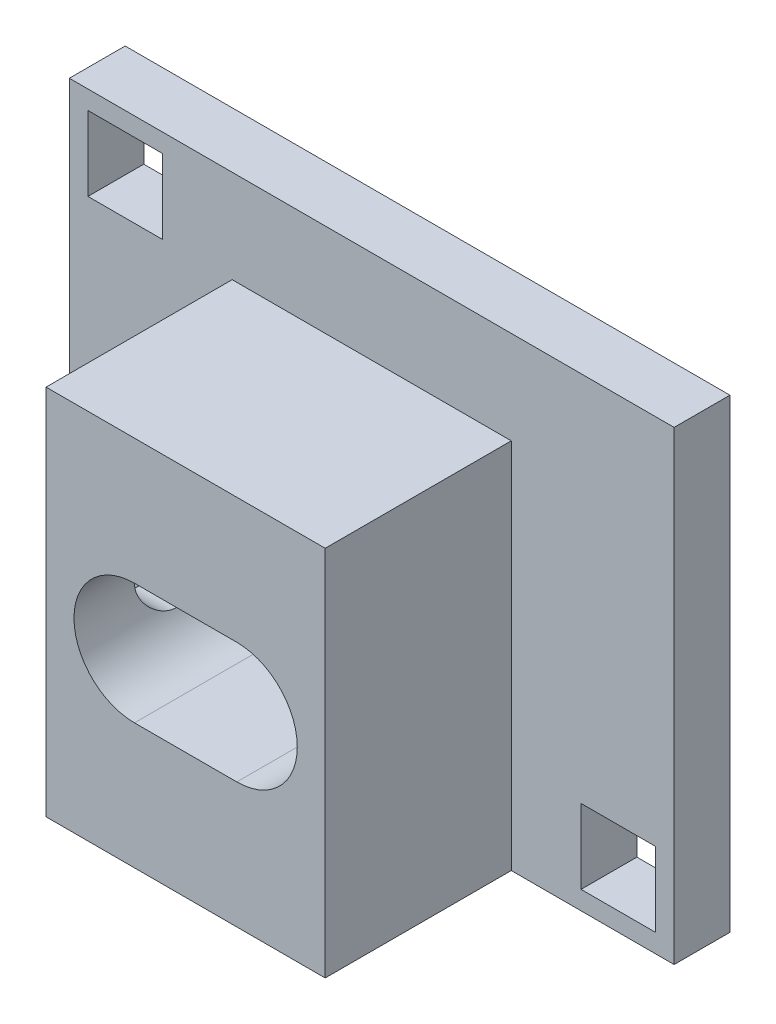
ISO-10303-21;
HEADER;
FILE_DESCRIPTION(('STEP AP214'),'2;1');
FILE_NAME('part.step','',(''),(''),'','','');
FILE_SCHEMA(('AUTOMOTIVE_DESIGN { 1 0 10303 214 1 1 1 1 }'));
ENDSEC;
DATA;
#1=APPLICATION_CONTEXT('core data for automotive mechanical design processes');
#2=APPLICATION_PROTOCOL_DEFINITION('international standard','automotive_design',2000,#1);
#3=PRODUCT_CONTEXT('',#1,'mechanical');
#4=PRODUCT('Part','Part','',(#3));
#5=PRODUCT_RELATED_PRODUCT_CATEGORY('part','',(#4));
#6=PRODUCT_DEFINITION_FORMATION('','',#4);
#7=PRODUCT_DEFINITION_CONTEXT('part definition',#1,'design');
#8=PRODUCT_DEFINITION('design','',#6,#7);
#9=PRODUCT_DEFINITION_SHAPE('','',#8);
#10=(LENGTH_UNIT() NAMED_UNIT(*) SI_UNIT(.MILLI.,.METRE.));
#11=(NAMED_UNIT(*) PLANE_ANGLE_UNIT() SI_UNIT($,.RADIAN.));
#12=(NAMED_UNIT(*) SI_UNIT($,.STERADIAN.) SOLID_ANGLE_UNIT());
#13=UNCERTAINTY_MEASURE_WITH_UNIT(LENGTH_MEASURE(1.E-05),#10,'distance_accuracy_value','');
#14=(GEOMETRIC_REPRESENTATION_CONTEXT(3) GLOBAL_UNCERTAINTY_ASSIGNED_CONTEXT((#13)) GLOBAL_UNIT_ASSIGNED_CONTEXT((#10,
#11,#12)) REPRESENTATION_CONTEXT('',''));
#15=CARTESIAN_POINT('',(0.,0.,0.));
#16=DIRECTION('',(0.,0.,1.));
#17=DIRECTION('',(1.,0.,0.));
#18=AXIS2_PLACEMENT_3D('',#15,#16,#17);
#19=CARTESIAN_POINT('',(0.,0.,6.));
#20=DIRECTION('',(0.,0.,-1.));
#21=DIRECTION('',(-1.,0.,0.));
#22=AXIS2_PLACEMENT_3D('',#19,#20,#21);
#23=PLANE('',#22);
#24=DIRECTION('',(-1.,0.,0.));
#25=VECTOR('',#24,1.);
#26=CARTESIAN_POINT('',(-30.5,23.,6.));
#27=LINE('',#26,#25);
#28=CARTESIAN_POINT('',(-22.5,23.,6.));
#29=VERTEX_POINT('',#28);
#30=CARTESIAN_POINT('',(-30.5,23.,6.));
#31=VERTEX_POINT('',#30);
#32=EDGE_CURVE('E325',#29,#31,#27,.T.);
#33=ORIENTED_EDGE('',*,*,#32,.F.);
#34=DIRECTION('',(0.,1.,0.));
#35=VECTOR('',#34,1.);
#36=CARTESIAN_POINT('',(-22.5,15.,6.));
#37=LINE('',#36,#35);
#38=CARTESIAN_POINT('',(-22.5,15.,6.));
#39=VERTEX_POINT('',#38);
#40=EDGE_CURVE('E328',#39,#29,#37,.T.);
#41=ORIENTED_EDGE('',*,*,#40,.F.);
#42=DIRECTION('',(1.,0.,0.));
#43=VECTOR('',#42,1.);
#44=CARTESIAN_POINT('',(-30.5,15.,6.));
#45=LINE('',#44,#43);
#46=CARTESIAN_POINT('',(-30.5,15.,6.));
#47=VERTEX_POINT('',#46);
#48=EDGE_CURVE('E318',#47,#39,#45,.T.);
#49=ORIENTED_EDGE('',*,*,#48,.F.);
#50=DIRECTION('',(0.,-1.,0.));
#51=VECTOR('',#50,1.);
#52=CARTESIAN_POINT('',(-30.5,15.,6.));
#53=LINE('',#52,#51);
#54=EDGE_CURVE('E322',#31,#47,#53,.T.);
#55=ORIENTED_EDGE('',*,*,#54,.F.);
#56=EDGE_LOOP('',(#33,#41,#49,#55));
#57=FACE_BOUND('',#56,.T.);
#58=DIRECTION('',(-1.,0.,0.));
#59=VECTOR('',#58,1.);
#60=CARTESIAN_POINT('',(30.5,-15.,6.));
#61=LINE('',#60,#59);
#62=CARTESIAN_POINT('',(30.5,-15.,6.));
#63=VERTEX_POINT('',#62);
#64=CARTESIAN_POINT('',(22.5,-15.,6.));
#65=VERTEX_POINT('',#64);
#66=EDGE_CURVE('E357',#63,#65,#61,.T.);
#67=ORIENTED_EDGE('',*,*,#66,.F.);
#68=DIRECTION('',(0.,1.,0.));
#69=VECTOR('',#68,1.);
#70=CARTESIAN_POINT('',(30.5,-23.,6.));
#71=LINE('',#70,#69);
#72=CARTESIAN_POINT('',(30.5,-23.,6.));
#73=VERTEX_POINT('',#72);
#74=EDGE_CURVE('E360',#73,#63,#71,.T.);
#75=ORIENTED_EDGE('',*,*,#74,.F.);
#76=DIRECTION('',(1.,0.,0.));
#77=VECTOR('',#76,1.);
#78=CARTESIAN_POINT('',(30.5,-23.,6.));
#79=LINE('',#78,#77);
#80=CARTESIAN_POINT('',(22.5,-23.,6.));
#81=VERTEX_POINT('',#80);
#82=EDGE_CURVE('E350',#81,#73,#79,.T.);
#83=ORIENTED_EDGE('',*,*,#82,.F.);
#84=DIRECTION('',(0.,-1.,0.));
#85=VECTOR('',#84,1.);
#86=CARTESIAN_POINT('',(22.5,-23.,6.));
#87=LINE('',#86,#85);
#88=EDGE_CURVE('E354',#65,#81,#87,.T.);
#89=ORIENTED_EDGE('',*,*,#88,.F.);
#90=EDGE_LOOP('',(#67,#75,#83,#89));
#91=FACE_BOUND('',#90,.T.);
#92=DIRECTION('',(0.,1.,0.));
#93=VECTOR('',#92,1.);
#94=CARTESIAN_POINT('',(15.,15.,6.));
#95=LINE('',#94,#93);
#96=CARTESIAN_POINT('',(15.,-25.,6.));
#97=VERTEX_POINT('',#96);
#98=CARTESIAN_POINT('',(15.,15.,6.));
#99=VERTEX_POINT('',#98);
#100=EDGE_CURVE('E221',#97,#99,#95,.T.);
#101=ORIENTED_EDGE('',*,*,#100,.F.);
#102=DIRECTION('',(1.,0.,0.));
#103=VECTOR('',#102,1.);
#104=CARTESIAN_POINT('',(-32.5,-25.,6.));
#105=LINE('',#104,#103);
#106=CARTESIAN_POINT('',(32.5,-25.,6.));
#107=VERTEX_POINT('',#106);
#108=EDGE_CURVE('E260',#97,#107,#105,.T.);
#109=ORIENTED_EDGE('',*,*,#108,.T.);
#110=DIRECTION('',(0.,1.,0.));
#111=VECTOR('',#110,1.);
#112=CARTESIAN_POINT('',(32.5,-25.,6.));
#113=LINE('',#112,#111);
#114=CARTESIAN_POINT('',(32.5,25.,6.));
#115=VERTEX_POINT('',#114);
#116=EDGE_CURVE('E280',#107,#115,#113,.T.);
#117=ORIENTED_EDGE('',*,*,#116,.T.);
#118=DIRECTION('',(-1.,0.,0.));
#119=VECTOR('',#118,1.);
#120=CARTESIAN_POINT('',(-32.5,25.,6.));
#121=LINE('',#120,#119);
#122=CARTESIAN_POINT('',(-32.5,25.,6.));
#123=VERTEX_POINT('',#122);
#124=EDGE_CURVE('E306',#115,#123,#121,.T.);
#125=ORIENTED_EDGE('',*,*,#124,.T.);
#126=DIRECTION('',(0.,-1.,0.));
#127=VECTOR('',#126,1.);
#128=CARTESIAN_POINT('',(-32.5,-25.,6.));
#129=LINE('',#128,#127);
#130=CARTESIAN_POINT('',(-32.5,-25.,6.));
#131=VERTEX_POINT('',#130);
#132=EDGE_CURVE('E264',#123,#131,#129,.T.);
#133=ORIENTED_EDGE('',*,*,#132,.T.);
#134=CARTESIAN_POINT('',(-15.,-25.,6.));
#135=VERTEX_POINT('',#134);
#136=EDGE_CURVE('E263',#131,#135,#105,.T.);
#137=ORIENTED_EDGE('',*,*,#136,.T.);
#138=DIRECTION('',(0.,-1.,0.));
#139=VECTOR('',#138,1.);
#140=CARTESIAN_POINT('',(-15.,15.,6.));
#141=LINE('',#140,#139);
#142=CARTESIAN_POINT('',(-15.,15.,6.));
#143=VERTEX_POINT('',#142);
#144=EDGE_CURVE('E226',#143,#135,#141,.T.);
#145=ORIENTED_EDGE('',*,*,#144,.F.);
#146=DIRECTION('',(-1.,0.,0.));
#147=VECTOR('',#146,1.);
#148=CARTESIAN_POINT('',(-15.,15.,6.));
#149=LINE('',#148,#147);
#150=EDGE_CURVE('E69',#99,#143,#149,.T.);
#151=ORIENTED_EDGE('',*,*,#150,.F.);
#152=EDGE_LOOP('',(#101,#109,#117,#125,#133,#137,#145,#151));
#153=FACE_BOUND('',#152,.T.);
#154=ADVANCED_FACE('F44',(#57,#91,#153),#23,.F.);
#155=CARTESIAN_POINT('',(32.5,-25.,6.));
#156=DIRECTION('',(-1.,0.,0.));
#157=DIRECTION('',(0.,0.,1.));
#158=AXIS2_PLACEMENT_3D('',#155,#156,#157);
#159=PLANE('',#158);
#160=DIRECTION('',(0.,1.,0.));
#161=VECTOR('',#160,1.);
#162=CARTESIAN_POINT('',(32.5,-25.,0.));
#163=LINE('',#162,#161);
#164=CARTESIAN_POINT('',(32.5,-25.,0.));
#165=VERTEX_POINT('',#164);
#166=CARTESIAN_POINT('',(32.5,25.,0.));
#167=VERTEX_POINT('',#166);
#168=EDGE_CURVE('E269',#165,#167,#163,.T.);
#169=ORIENTED_EDGE('',*,*,#168,.T.);
#170=DIRECTION('',(0.,0.,-1.));
#171=VECTOR('',#170,1.);
#172=CARTESIAN_POINT('',(32.5,25.,6.));
#173=LINE('',#172,#171);
#174=EDGE_CURVE('E13',#115,#167,#173,.T.);
#175=ORIENTED_EDGE('',*,*,#174,.F.);
#176=ORIENTED_EDGE('',*,*,#116,.F.);
#177=DIRECTION('',(0.,0.,-1.));
#178=VECTOR('',#177,1.);
#179=CARTESIAN_POINT('',(32.5,-25.,6.));
#180=LINE('',#179,#178);
#181=EDGE_CURVE('E281',#107,#165,#180,.T.);
#182=ORIENTED_EDGE('',*,*,#181,.T.);
#183=EDGE_LOOP('',(#169,#175,#176,#182));
#184=FACE_BOUND('',#183,.T.);
#185=ADVANCED_FACE('F46',(#184),#159,.F.);
#186=CARTESIAN_POINT('',(-32.5,25.,6.));
#187=DIRECTION('',(0.,-1.,0.));
#188=DIRECTION('',(0.,0.,-1.));
#189=AXIS2_PLACEMENT_3D('',#186,#187,#188);
#190=PLANE('',#189);
#191=DIRECTION('',(-1.,0.,0.));
#192=VECTOR('',#191,1.);
#193=CARTESIAN_POINT('',(-32.5,25.,0.));
#194=LINE('',#193,#192);
#195=CARTESIAN_POINT('',(-32.5,25.,0.));
#196=VERTEX_POINT('',#195);
#197=EDGE_CURVE('E273',#167,#196,#194,.T.);
#198=ORIENTED_EDGE('',*,*,#197,.T.);
#199=DIRECTION('',(0.,0.,-1.));
#200=VECTOR('',#199,1.);
#201=CARTESIAN_POINT('',(-32.5,25.,6.));
#202=LINE('',#201,#200);
#203=EDGE_CURVE('E53',#123,#196,#202,.T.);
#204=ORIENTED_EDGE('',*,*,#203,.F.);
#205=ORIENTED_EDGE('',*,*,#124,.F.);
#206=ORIENTED_EDGE('',*,*,#174,.T.);
#207=EDGE_LOOP('',(#198,#204,#205,#206));
#208=FACE_BOUND('',#207,.T.);
#209=ADVANCED_FACE('F381',(#208),#190,.F.);
#210=CARTESIAN_POINT('',(-32.5,-25.,6.));
#211=DIRECTION('',(1.,0.,0.));
#212=DIRECTION('',(0.,0.,-1.));
#213=AXIS2_PLACEMENT_3D('',#210,#211,#212);
#214=PLANE('',#213);
#215=DIRECTION('',(0.,-1.,0.));
#216=VECTOR('',#215,1.);
#217=CARTESIAN_POINT('',(-32.5,-25.,0.));
#218=LINE('',#217,#216);
#219=CARTESIAN_POINT('',(-32.5,-25.,0.));
#220=VERTEX_POINT('',#219);
#221=EDGE_CURVE('E276',#196,#220,#218,.T.);
#222=ORIENTED_EDGE('',*,*,#221,.T.);
#223=DIRECTION('',(0.,0.,-1.));
#224=VECTOR('',#223,1.);
#225=CARTESIAN_POINT('',(-32.5,-25.,6.));
#226=LINE('',#225,#224);
#227=EDGE_CURVE('E284',#131,#220,#226,.T.);
#228=ORIENTED_EDGE('',*,*,#227,.F.);
#229=ORIENTED_EDGE('',*,*,#132,.F.);
#230=ORIENTED_EDGE('',*,*,#203,.T.);
#231=EDGE_LOOP('',(#222,#228,#229,#230));
#232=FACE_BOUND('',#231,.T.);
#233=ADVANCED_FACE('F292',(#232),#214,.F.);
#234=CARTESIAN_POINT('',(-32.5,-25.,6.));
#235=DIRECTION('',(0.,1.,0.));
#236=DIRECTION('',(0.,0.,1.));
#237=AXIS2_PLACEMENT_3D('',#234,#235,#236);
#238=PLANE('',#237);
#239=DIRECTION('',(1.,0.,0.));
#240=VECTOR('',#239,1.);
#241=CARTESIAN_POINT('',(-32.5,-25.,0.));
#242=LINE('',#241,#240);
#243=EDGE_CURVE('E278',#220,#165,#242,.T.);
#244=ORIENTED_EDGE('',*,*,#243,.T.);
#245=ORIENTED_EDGE('',*,*,#181,.F.);
#246=ORIENTED_EDGE('',*,*,#108,.F.);
#247=DIRECTION('',(0.,0.,-1.));
#248=VECTOR('',#247,1.);
#249=CARTESIAN_POINT('',(15.,-25.,26.));
#250=LINE('',#249,#248);
#251=CARTESIAN_POINT('',(15.,-25.,26.));
#252=VERTEX_POINT('',#251);
#253=EDGE_CURVE('E232',#252,#97,#250,.T.);
#254=ORIENTED_EDGE('',*,*,#253,.F.);
#255=DIRECTION('',(1.,0.,0.));
#256=VECTOR('',#255,1.);
#257=CARTESIAN_POINT('',(-15.,-25.,26.));
#258=LINE('',#257,#256);
#259=CARTESIAN_POINT('',(-15.,-25.,26.));
#260=VERTEX_POINT('',#259);
#261=EDGE_CURVE('E230',#260,#252,#258,.T.);
#262=ORIENTED_EDGE('',*,*,#261,.F.);
#263=DIRECTION('',(0.,0.,-1.));
#264=VECTOR('',#263,1.);
#265=CARTESIAN_POINT('',(-15.,-25.,26.));
#266=LINE('',#265,#264);
#267=EDGE_CURVE('E243',#260,#135,#266,.T.);
#268=ORIENTED_EDGE('',*,*,#267,.T.);
#269=ORIENTED_EDGE('',*,*,#136,.F.);
#270=ORIENTED_EDGE('',*,*,#227,.T.);
#271=EDGE_LOOP('',(#244,#245,#246,#254,#262,#268,#269,#270));
#272=FACE_BOUND('',#271,.T.);
#273=ADVANCED_FACE('F300',(#272),#238,.F.);
#274=CARTESIAN_POINT('',(0.,0.,0.));
#275=DIRECTION('',(0.,0.,-1.));
#276=DIRECTION('',(-1.,0.,0.));
#277=AXIS2_PLACEMENT_3D('',#274,#275,#276);
#278=PLANE('',#277);
#279=DIRECTION('',(0.,1.,0.));
#280=VECTOR('',#279,1.);
#281=CARTESIAN_POINT('',(30.5,-23.,0.));
#282=LINE('',#281,#280);
#283=CARTESIAN_POINT('',(30.5,-23.,0.));
#284=VERTEX_POINT('',#283);
#285=CARTESIAN_POINT('',(30.5,-15.,0.));
#286=VERTEX_POINT('',#285);
#287=EDGE_CURVE('E353',#284,#286,#282,.T.);
#288=ORIENTED_EDGE('',*,*,#287,.T.);
#289=DIRECTION('',(-1.,0.,0.));
#290=VECTOR('',#289,1.);
#291=CARTESIAN_POINT('',(30.5,-15.,0.));
#292=LINE('',#291,#290);
#293=CARTESIAN_POINT('',(22.5,-15.,0.));
#294=VERTEX_POINT('',#293);
#295=EDGE_CURVE('E367',#286,#294,#292,.T.);
#296=ORIENTED_EDGE('',*,*,#295,.T.);
#297=DIRECTION('',(0.,-1.,0.));
#298=VECTOR('',#297,1.);
#299=CARTESIAN_POINT('',(22.5,-23.,0.));
#300=LINE('',#299,#298);
#301=CARTESIAN_POINT('',(22.5,-23.,0.));
#302=VERTEX_POINT('',#301);
#303=EDGE_CURVE('E364',#294,#302,#300,.T.);
#304=ORIENTED_EDGE('',*,*,#303,.T.);
#305=DIRECTION('',(1.,0.,0.));
#306=VECTOR('',#305,1.);
#307=CARTESIAN_POINT('',(30.5,-23.,0.));
#308=LINE('',#307,#306);
#309=EDGE_CURVE('E345',#302,#284,#308,.T.);
#310=ORIENTED_EDGE('',*,*,#309,.T.);
#311=EDGE_LOOP('',(#288,#296,#304,#310));
#312=FACE_BOUND('',#311,.T.);
#313=DIRECTION('',(0.,1.,0.));
#314=VECTOR('',#313,1.);
#315=CARTESIAN_POINT('',(-22.5,15.,0.));
#316=LINE('',#315,#314);
#317=CARTESIAN_POINT('',(-22.5,15.,0.));
#318=VERTEX_POINT('',#317);
#319=CARTESIAN_POINT('',(-22.5,23.,0.));
#320=VERTEX_POINT('',#319);
#321=EDGE_CURVE('E321',#318,#320,#316,.T.);
#322=ORIENTED_EDGE('',*,*,#321,.T.);
#323=DIRECTION('',(-1.,0.,0.));
#324=VECTOR('',#323,1.);
#325=CARTESIAN_POINT('',(-30.5,23.,0.));
#326=LINE('',#325,#324);
#327=CARTESIAN_POINT('',(-30.5,23.,0.));
#328=VERTEX_POINT('',#327);
#329=EDGE_CURVE('E336',#320,#328,#326,.T.);
#330=ORIENTED_EDGE('',*,*,#329,.T.);
#331=DIRECTION('',(0.,-1.,0.));
#332=VECTOR('',#331,1.);
#333=CARTESIAN_POINT('',(-30.5,15.,0.));
#334=LINE('',#333,#332);
#335=CARTESIAN_POINT('',(-30.5,15.,0.));
#336=VERTEX_POINT('',#335);
#337=EDGE_CURVE('E333',#328,#336,#334,.T.);
#338=ORIENTED_EDGE('',*,*,#337,.T.);
#339=DIRECTION('',(1.,0.,0.));
#340=VECTOR('',#339,1.);
#341=CARTESIAN_POINT('',(-30.5,15.,0.));
#342=LINE('',#341,#340);
#343=EDGE_CURVE('E313',#336,#318,#342,.T.);
#344=ORIENTED_EDGE('',*,*,#343,.T.);
#345=EDGE_LOOP('',(#322,#330,#338,#344));
#346=FACE_BOUND('',#345,.T.);
#347=ORIENTED_EDGE('',*,*,#168,.F.);
#348=ORIENTED_EDGE('',*,*,#243,.F.);
#349=ORIENTED_EDGE('',*,*,#221,.F.);
#350=ORIENTED_EDGE('',*,*,#197,.F.);
#351=EDGE_LOOP('',(#347,#348,#349,#350));
#352=FACE_BOUND('',#351,.T.);
#353=ADVANCED_FACE('F298',(#312,#346,#352),#278,.T.);
#354=CARTESIAN_POINT('',(-22.5,15.,0.));
#355=DIRECTION('',(1.,0.,0.));
#356=DIRECTION('',(0.,0.,-1.));
#357=AXIS2_PLACEMENT_3D('',#354,#355,#356);
#358=PLANE('',#357);
#359=ORIENTED_EDGE('',*,*,#40,.T.);
#360=DIRECTION('',(0.,0.,1.));
#361=VECTOR('',#360,1.);
#362=CARTESIAN_POINT('',(-22.5,23.,0.));
#363=LINE('',#362,#361);
#364=EDGE_CURVE('E309',#320,#29,#363,.T.);
#365=ORIENTED_EDGE('',*,*,#364,.F.);
#366=ORIENTED_EDGE('',*,*,#321,.F.);
#367=DIRECTION('',(0.,0.,1.));
#368=VECTOR('',#367,1.);
#369=CARTESIAN_POINT('',(-22.5,15.,0.));
#370=LINE('',#369,#368);
#371=EDGE_CURVE('E274',#318,#39,#370,.T.);
#372=ORIENTED_EDGE('',*,*,#371,.T.);
#373=EDGE_LOOP('',(#359,#365,#366,#372));
#374=FACE_BOUND('',#373,.T.);
#375=ADVANCED_FACE('F397',(#374),#358,.F.);
#376=CARTESIAN_POINT('',(-30.5,15.,0.));
#377=DIRECTION('',(0.,-1.,0.));
#378=DIRECTION('',(0.,0.,-1.));
#379=AXIS2_PLACEMENT_3D('',#376,#377,#378);
#380=PLANE('',#379);
#381=ORIENTED_EDGE('',*,*,#48,.T.);
#382=ORIENTED_EDGE('',*,*,#371,.F.);
#383=ORIENTED_EDGE('',*,*,#343,.F.);
#384=DIRECTION('',(0.,0.,1.));
#385=VECTOR('',#384,1.);
#386=CARTESIAN_POINT('',(-30.5,15.,0.));
#387=LINE('',#386,#385);
#388=EDGE_CURVE('E315',#336,#47,#387,.T.);
#389=ORIENTED_EDGE('',*,*,#388,.T.);
#390=EDGE_LOOP('',(#381,#382,#383,#389));
#391=FACE_BOUND('',#390,.T.);
#392=ADVANCED_FACE('F418',(#391),#380,.F.);
#393=CARTESIAN_POINT('',(-30.5,15.,0.));
#394=DIRECTION('',(-1.,0.,0.));
#395=DIRECTION('',(0.,0.,1.));
#396=AXIS2_PLACEMENT_3D('',#393,#394,#395);
#397=PLANE('',#396);
#398=ORIENTED_EDGE('',*,*,#54,.T.);
#399=ORIENTED_EDGE('',*,*,#388,.F.);
#400=ORIENTED_EDGE('',*,*,#337,.F.);
#401=DIRECTION('',(0.,0.,1.));
#402=VECTOR('',#401,1.);
#403=CARTESIAN_POINT('',(-30.5,23.,0.));
#404=LINE('',#403,#402);
#405=EDGE_CURVE('E312',#328,#31,#404,.T.);
#406=ORIENTED_EDGE('',*,*,#405,.T.);
#407=EDGE_LOOP('',(#398,#399,#400,#406));
#408=FACE_BOUND('',#407,.T.);
#409=ADVANCED_FACE('F425',(#408),#397,.F.);
#410=CARTESIAN_POINT('',(-30.5,23.,0.));
#411=DIRECTION('',(0.,1.,0.));
#412=DIRECTION('',(0.,0.,1.));
#413=AXIS2_PLACEMENT_3D('',#410,#411,#412);
#414=PLANE('',#413);
#415=ORIENTED_EDGE('',*,*,#32,.T.);
#416=ORIENTED_EDGE('',*,*,#405,.F.);
#417=ORIENTED_EDGE('',*,*,#329,.F.);
#418=ORIENTED_EDGE('',*,*,#364,.T.);
#419=EDGE_LOOP('',(#415,#416,#417,#418));
#420=FACE_BOUND('',#419,.T.);
#421=ADVANCED_FACE('F433',(#420),#414,.F.);
#422=CARTESIAN_POINT('',(30.5,-23.,0.));
#423=DIRECTION('',(1.,0.,0.));
#424=DIRECTION('',(0.,0.,-1.));
#425=AXIS2_PLACEMENT_3D('',#422,#423,#424);
#426=PLANE('',#425);
#427=ORIENTED_EDGE('',*,*,#74,.T.);
#428=DIRECTION('',(0.,0.,1.));
#429=VECTOR('',#428,1.);
#430=CARTESIAN_POINT('',(30.5,-15.,0.));
#431=LINE('',#430,#429);
#432=EDGE_CURVE('E341',#286,#63,#431,.T.);
#433=ORIENTED_EDGE('',*,*,#432,.F.);
#434=ORIENTED_EDGE('',*,*,#287,.F.);
#435=DIRECTION('',(0.,0.,1.));
#436=VECTOR('',#435,1.);
#437=CARTESIAN_POINT('',(30.5,-23.,0.));
#438=LINE('',#437,#436);
#439=EDGE_CURVE('E330',#284,#73,#438,.T.);
#440=ORIENTED_EDGE('',*,*,#439,.T.);
#441=EDGE_LOOP('',(#427,#433,#434,#440));
#442=FACE_BOUND('',#441,.T.);
#443=ADVANCED_FACE('F441',(#442),#426,.F.);
#444=CARTESIAN_POINT('',(30.5,-23.,0.));
#445=DIRECTION('',(0.,-1.,0.));
#446=DIRECTION('',(0.,0.,-1.));
#447=AXIS2_PLACEMENT_3D('',#444,#445,#446);
#448=PLANE('',#447);
#449=ORIENTED_EDGE('',*,*,#82,.T.);
#450=ORIENTED_EDGE('',*,*,#439,.F.);
#451=ORIENTED_EDGE('',*,*,#309,.F.);
#452=DIRECTION('',(0.,0.,1.));
#453=VECTOR('',#452,1.);
#454=CARTESIAN_POINT('',(22.5,-23.,0.));
#455=LINE('',#454,#453);
#456=EDGE_CURVE('E347',#302,#81,#455,.T.);
#457=ORIENTED_EDGE('',*,*,#456,.T.);
#458=EDGE_LOOP('',(#449,#450,#451,#457));
#459=FACE_BOUND('',#458,.T.);
#460=ADVANCED_FACE('F448',(#459),#448,.F.);
#461=CARTESIAN_POINT('',(22.5,-23.,0.));
#462=DIRECTION('',(-1.,0.,0.));
#463=DIRECTION('',(0.,0.,1.));
#464=AXIS2_PLACEMENT_3D('',#461,#462,#463);
#465=PLANE('',#464);
#466=ORIENTED_EDGE('',*,*,#88,.T.);
#467=ORIENTED_EDGE('',*,*,#456,.F.);
#468=ORIENTED_EDGE('',*,*,#303,.F.);
#469=DIRECTION('',(0.,0.,1.));
#470=VECTOR('',#469,1.);
#471=CARTESIAN_POINT('',(22.5,-15.,0.));
#472=LINE('',#471,#470);
#473=EDGE_CURVE('E344',#294,#65,#472,.T.);
#474=ORIENTED_EDGE('',*,*,#473,.T.);
#475=EDGE_LOOP('',(#466,#467,#468,#474));
#476=FACE_BOUND('',#475,.T.);
#477=ADVANCED_FACE('F456',(#476),#465,.F.);
#478=CARTESIAN_POINT('',(30.5,-15.,0.));
#479=DIRECTION('',(0.,1.,0.));
#480=DIRECTION('',(-1.,0.,0.));
#481=AXIS2_PLACEMENT_3D('',#478,#479,#480);
#482=PLANE('',#481);
#483=ORIENTED_EDGE('',*,*,#66,.T.);
#484=ORIENTED_EDGE('',*,*,#473,.F.);
#485=ORIENTED_EDGE('',*,*,#295,.F.);
#486=ORIENTED_EDGE('',*,*,#432,.T.);
#487=EDGE_LOOP('',(#483,#484,#485,#486));
#488=FACE_BOUND('',#487,.T.);
#489=ADVANCED_FACE('F464',(#488),#482,.F.);
#490=CARTESIAN_POINT('',(15.,15.,26.));
#491=DIRECTION('',(-1.,0.,0.));
#492=DIRECTION('',(0.,-1.,0.));
#493=AXIS2_PLACEMENT_3D('',#490,#491,#492);
#494=PLANE('',#493);
#495=ORIENTED_EDGE('',*,*,#100,.T.);
#496=DIRECTION('',(0.,0.,-1.));
#497=VECTOR('',#496,1.);
#498=CARTESIAN_POINT('',(15.,15.,26.));
#499=LINE('',#498,#497);
#500=CARTESIAN_POINT('',(15.,15.,26.));
#501=VERTEX_POINT('',#500);
#502=EDGE_CURVE('E250',#501,#99,#499,.T.);
#503=ORIENTED_EDGE('',*,*,#502,.F.);
#504=DIRECTION('',(0.,1.,0.));
#505=VECTOR('',#504,1.);
#506=CARTESIAN_POINT('',(15.,15.,26.));
#507=LINE('',#506,#505);
#508=EDGE_CURVE('E222',#252,#501,#507,.T.);
#509=ORIENTED_EDGE('',*,*,#508,.F.);
#510=ORIENTED_EDGE('',*,*,#253,.T.);
#511=EDGE_LOOP('',(#495,#503,#509,#510));
#512=FACE_BOUND('',#511,.T.);
#513=ADVANCED_FACE('F375',(#512),#494,.F.);
#514=CARTESIAN_POINT('',(-15.,15.,26.));
#515=DIRECTION('',(0.,-1.,0.));
#516=DIRECTION('',(0.,0.,-1.));
#517=AXIS2_PLACEMENT_3D('',#514,#515,#516);
#518=PLANE('',#517);
#519=ORIENTED_EDGE('',*,*,#150,.T.);
#520=DIRECTION('',(0.,0.,-1.));
#521=VECTOR('',#520,1.);
#522=CARTESIAN_POINT('',(-15.,15.,26.));
#523=LINE('',#522,#521);
#524=CARTESIAN_POINT('',(-15.,15.,26.));
#525=VERTEX_POINT('',#524);
#526=EDGE_CURVE('E236',#525,#143,#523,.T.);
#527=ORIENTED_EDGE('',*,*,#526,.F.);
#528=DIRECTION('',(-1.,0.,0.));
#529=VECTOR('',#528,1.);
#530=CARTESIAN_POINT('',(-15.,15.,26.));
#531=LINE('',#530,#529);
#532=EDGE_CURVE('E225',#501,#525,#531,.T.);
#533=ORIENTED_EDGE('',*,*,#532,.F.);
#534=ORIENTED_EDGE('',*,*,#502,.T.);
#535=EDGE_LOOP('',(#519,#527,#533,#534));
#536=FACE_BOUND('',#535,.T.);
#537=ADVANCED_FACE('F373',(#536),#518,.F.);
#538=CARTESIAN_POINT('',(-15.,15.,26.));
#539=DIRECTION('',(1.,0.,0.));
#540=DIRECTION('',(0.,1.,0.));
#541=AXIS2_PLACEMENT_3D('',#538,#539,#540);
#542=PLANE('',#541);
#543=CARTESIAN_POINT('',(-15.,-5.,16.));
#544=DIRECTION('',(-1.,0.,0.));
#545=DIRECTION('',(0.,-1.,0.));
#546=AXIS2_PLACEMENT_3D('',#543,#544,#545);
#547=CIRCLE('',#546,3.5);
#548=CARTESIAN_POINT('',(-15.,-8.5,16.));
#549=VERTEX_POINT('',#548);
#550=EDGE_CURVE('E612',#549,#549,#547,.T.);
#551=ORIENTED_EDGE('',*,*,#550,.F.);
#552=EDGE_LOOP('',(#551));
#553=FACE_BOUND('',#552,.T.);
#554=ORIENTED_EDGE('',*,*,#144,.T.);
#555=ORIENTED_EDGE('',*,*,#267,.F.);
#556=DIRECTION('',(0.,-1.,0.));
#557=VECTOR('',#556,1.);
#558=CARTESIAN_POINT('',(-15.,15.,26.));
#559=LINE('',#558,#557);
#560=EDGE_CURVE('E228',#525,#260,#559,.T.);
#561=ORIENTED_EDGE('',*,*,#560,.F.);
#562=ORIENTED_EDGE('',*,*,#526,.T.);
#563=EDGE_LOOP('',(#554,#555,#561,#562));
#564=FACE_BOUND('',#563,.T.);
#565=ADVANCED_FACE('F380',(#553,#564),#542,.F.);
#566=CARTESIAN_POINT('',(0.,0.,26.));
#567=DIRECTION('',(0.,0.,1.));
#568=DIRECTION('',(1.,0.,0.));
#569=AXIS2_PLACEMENT_3D('',#566,#567,#568);
#570=PLANE('',#569);
#571=DIRECTION('',(1.,0.,0.));
#572=VECTOR('',#571,1.);
#573=CARTESIAN_POINT('',(-5.5,-11.5,26.));
#574=LINE('',#573,#572);
#575=CARTESIAN_POINT('',(-5.5,-11.5,26.));
#576=VERTEX_POINT('',#575);
#577=CARTESIAN_POINT('',(5.5,-11.5,26.));
#578=VERTEX_POINT('',#577);
#579=EDGE_CURVE('E200',#576,#578,#574,.T.);
#580=ORIENTED_EDGE('',*,*,#579,.F.);
#581=CARTESIAN_POINT('',(-5.5,-5.,26.));
#582=DIRECTION('',(0.,0.,1.));
#583=DIRECTION('',(1.,0.,0.));
#584=AXIS2_PLACEMENT_3D('',#581,#582,#583);
#585=CIRCLE('',#584,6.5);
#586=CARTESIAN_POINT('',(-5.5,1.5,26.));
#587=VERTEX_POINT('',#586);
#588=EDGE_CURVE('E211',#587,#576,#585,.T.);
#589=ORIENTED_EDGE('',*,*,#588,.F.);
#590=DIRECTION('',(-1.,0.,0.));
#591=VECTOR('',#590,1.);
#592=CARTESIAN_POINT('',(-5.5,1.49999999999999,26.));
#593=LINE('',#592,#591);
#594=CARTESIAN_POINT('',(5.5,1.5,26.));
#595=VERTEX_POINT('',#594);
#596=EDGE_CURVE('E61',#595,#587,#593,.T.);
#597=ORIENTED_EDGE('',*,*,#596,.F.);
#598=CARTESIAN_POINT('',(5.5,-5.,26.));
#599=DIRECTION('',(0.,0.,1.));
#600=DIRECTION('',(1.,0.,0.));
#601=AXIS2_PLACEMENT_3D('',#598,#599,#600);
#602=CIRCLE('',#601,6.5);
#603=EDGE_CURVE('E207',#578,#595,#602,.T.);
#604=ORIENTED_EDGE('',*,*,#603,.F.);
#605=EDGE_LOOP('',(#580,#589,#597,#604));
#606=FACE_BOUND('',#605,.T.);
#607=ORIENTED_EDGE('',*,*,#508,.T.);
#608=ORIENTED_EDGE('',*,*,#532,.T.);
#609=ORIENTED_EDGE('',*,*,#560,.T.);
#610=ORIENTED_EDGE('',*,*,#261,.T.);
#611=EDGE_LOOP('',(#607,#608,#609,#610));
#612=FACE_BOUND('',#611,.T.);
#613=ADVANCED_FACE('F377',(#606,#612),#570,.T.);
#614=CARTESIAN_POINT('',(0.,0.,6.));
#615=DIRECTION('',(0.,0.,-1.));
#616=DIRECTION('',(-1.,0.,0.));
#617=AXIS2_PLACEMENT_3D('',#614,#615,#616);
#618=PLANE('',#617);
#619=CARTESIAN_POINT('',(-5.5,-5.,6.));
#620=DIRECTION('',(0.,0.,-1.));
#621=DIRECTION('',(-1.,0.,0.));
#622=AXIS2_PLACEMENT_3D('',#619,#620,#621);
#623=CIRCLE('',#622,6.5);
#624=CARTESIAN_POINT('',(-5.5,1.49999999999999,6.));
#625=VERTEX_POINT('',#624);
#626=CARTESIAN_POINT('',(-5.5,-11.5,6.));
#627=VERTEX_POINT('',#626);
#628=EDGE_CURVE('E204',#625,#627,#623,.F.);
#629=ORIENTED_EDGE('',*,*,#628,.T.);
#630=DIRECTION('',(1.,0.,0.));
#631=VECTOR('',#630,1.);
#632=CARTESIAN_POINT('',(-5.5,-11.5,6.));
#633=LINE('',#632,#631);
#634=CARTESIAN_POINT('',(5.5,-11.5,6.));
#635=VERTEX_POINT('',#634);
#636=EDGE_CURVE('E197',#627,#635,#633,.T.);
#637=ORIENTED_EDGE('',*,*,#636,.T.);
#638=CARTESIAN_POINT('',(5.5,-5.,6.));
#639=DIRECTION('',(0.,0.,-1.));
#640=DIRECTION('',(-1.,0.,0.));
#641=AXIS2_PLACEMENT_3D('',#638,#639,#640);
#642=CIRCLE('',#641,6.5);
#643=CARTESIAN_POINT('',(5.5,1.5,6.));
#644=VERTEX_POINT('',#643);
#645=EDGE_CURVE('E184',#635,#644,#642,.F.);
#646=ORIENTED_EDGE('',*,*,#645,.T.);
#647=DIRECTION('',(-1.,0.,0.));
#648=VECTOR('',#647,1.);
#649=CARTESIAN_POINT('',(-5.5,1.49999999999999,6.));
#650=LINE('',#649,#648);
#651=EDGE_CURVE('E216',#644,#625,#650,.T.);
#652=ORIENTED_EDGE('',*,*,#651,.T.);
#653=EDGE_LOOP('',(#629,#637,#646,#652));
#654=FACE_BOUND('',#653,.T.);
#655=ADVANCED_FACE('F203',(#654),#618,.F.);
#656=CARTESIAN_POINT('',(-5.5,-11.5,-21.2946881279124));
#657=DIRECTION('',(0.,-1.,0.));
#658=DIRECTION('',(1.,0.,0.));
#659=AXIS2_PLACEMENT_3D('',#656,#657,#658);
#660=PLANE('',#659);
#661=DIRECTION('',(0.,0.,1.));
#662=VECTOR('',#661,1.);
#663=CARTESIAN_POINT('',(-5.5,-11.5,-21.2946881279124));
#664=LINE('',#663,#662);
#665=EDGE_CURVE('E214',#627,#576,#664,.T.);
#666=ORIENTED_EDGE('',*,*,#665,.T.);
#667=ORIENTED_EDGE('',*,*,#579,.T.);
#668=DIRECTION('',(0.,0.,1.));
#669=VECTOR('',#668,1.);
#670=CARTESIAN_POINT('',(5.5,-11.5,-21.2946881279124));
#671=LINE('',#670,#669);
#672=EDGE_CURVE('E188',#635,#578,#671,.T.);
#673=ORIENTED_EDGE('',*,*,#672,.F.);
#674=ORIENTED_EDGE('',*,*,#636,.F.);
#675=EDGE_LOOP('',(#666,#667,#673,#674));
#676=FACE_BOUND('',#675,.T.);
#677=ADVANCED_FACE('F196',(#676),#660,.F.);
#678=CARTESIAN_POINT('',(5.5,-5.,-21.2946881279124));
#679=DIRECTION('',(0.,0.,1.));
#680=DIRECTION('',(1.,0.,0.));
#681=AXIS2_PLACEMENT_3D('',#678,#679,#680);
#682=CYLINDRICAL_SURFACE('',#681,6.5);
#683=ORIENTED_EDGE('',*,*,#672,.T.);
#684=ORIENTED_EDGE('',*,*,#603,.T.);
#685=DIRECTION('',(0.,0.,1.));
#686=VECTOR('',#685,1.);
#687=CARTESIAN_POINT('',(5.5,1.5,-21.2946881279124));
#688=LINE('',#687,#686);
#689=EDGE_CURVE('E190',#644,#595,#688,.T.);
#690=ORIENTED_EDGE('',*,*,#689,.F.);
#691=ORIENTED_EDGE('',*,*,#645,.F.);
#692=EDGE_LOOP('',(#683,#684,#690,#691));
#693=FACE_BOUND('',#692,.T.);
#694=ADVANCED_FACE('F186',(#693),#682,.F.);
#695=CARTESIAN_POINT('',(-5.5,1.49999999999999,-21.2946881279124));
#696=DIRECTION('',(0.,1.,0.));
#697=DIRECTION('',(-1.,0.,0.));
#698=AXIS2_PLACEMENT_3D('',#695,#696,#697);
#699=PLANE('',#698);
#700=ORIENTED_EDGE('',*,*,#689,.T.);
#701=ORIENTED_EDGE('',*,*,#596,.T.);
#702=DIRECTION('',(0.,0.,1.));
#703=VECTOR('',#702,1.);
#704=CARTESIAN_POINT('',(-5.5,1.49999999999999,-21.2946881279124));
#705=LINE('',#704,#703);
#706=EDGE_CURVE('E215',#625,#587,#705,.T.);
#707=ORIENTED_EDGE('',*,*,#706,.F.);
#708=ORIENTED_EDGE('',*,*,#651,.F.);
#709=EDGE_LOOP('',(#700,#701,#707,#708));
#710=FACE_BOUND('',#709,.T.);
#711=ADVANCED_FACE('F518',(#710),#699,.F.);
#712=CARTESIAN_POINT('',(-5.5,-5.,-21.2946881279124));
#713=DIRECTION('',(0.,0.,1.));
#714=DIRECTION('',(1.,0.,0.));
#715=AXIS2_PLACEMENT_3D('',#712,#713,#714);
#716=CYLINDRICAL_SURFACE('',#715,6.5);
#717=CARTESIAN_POINT('',(-10.9772255750517,-8.5,16.));
#718=CARTESIAN_POINT('',(-10.9772248931887,-8.50000054532164,15.9099100482831));
#719=CARTESIAN_POINT('',(-10.9794556756543,-8.49651727836715,15.8198261633394));
#720=CARTESIAN_POINT('',(-10.9882870587806,-8.48263878220815,15.6403769459361));
#721=CARTESIAN_POINT('',(-10.9948892385073,-8.47224105530901,15.5510118849462));
#722=CARTESIAN_POINT('',(-11.0122179199393,-8.44466518959071,15.3736239870864));
#723=CARTESIAN_POINT('',(-11.0229496770291,-8.42747841014159,15.2856030097344));
#724=CARTESIAN_POINT('',(-11.0481332322295,-8.38656027599752,15.1116253923762));
#725=CARTESIAN_POINT('',(-11.0625866815133,-8.36282601610038,15.0256696872064));
#726=CARTESIAN_POINT('',(-11.1105939024364,-8.28254929091411,14.7728286219417));
#727=CARTESIAN_POINT('',(-11.1489308246275,-8.21672958099874,14.6096952828755));
#728=CARTESIAN_POINT('',(-11.2339042447955,-8.06268645642129,14.2969353146526));
#729=CARTESIAN_POINT('',(-11.2805422120945,-7.97445907431911,14.1473110837467));
#730=CARTESIAN_POINT('',(-11.3823530996864,-7.76809956144361,13.8497785226174));
#731=CARTESIAN_POINT('',(-11.4379153091449,-7.64790241151872,13.7034310322083));
#732=CARTESIAN_POINT('',(-11.5481810909272,-7.38533642219444,13.431745547185));
#733=CARTESIAN_POINT('',(-11.6028841551773,-7.24295496968899,13.3064195892701));
#734=CARTESIAN_POINT('',(-11.7105978214161,-6.92577507209237,13.0702443296714));
#735=CARTESIAN_POINT('',(-11.7631093063327,-6.74928226688631,12.9614001799224));
#736=CARTESIAN_POINT('',(-11.8322251019584,-6.4704330288277,12.8221595861184));
#737=CARTESIAN_POINT('',(-11.8536609741926,-6.37509555759605,12.7797396269764));
#738=CARTESIAN_POINT('',(-11.8926997386614,-6.18034738131059,12.7033814104791));
#739=CARTESIAN_POINT('',(-11.9103049176322,-6.08093914865114,12.6694380911871));
#740=CARTESIAN_POINT('',(-11.9398919966601,-5.88692889338459,12.6128565584315));
#741=CARTESIAN_POINT('',(-11.9522108659808,-5.79257771801049,12.5895316340078));
#742=CARTESIAN_POINT('',(-11.9727841603053,-5.60187686186127,12.5507674666143));
#743=CARTESIAN_POINT('',(-11.9810406715066,-5.50552823341458,12.5353241759308));
#744=CARTESIAN_POINT('',(-11.9932509526848,-5.3116356828096,12.5125363590249));
#745=CARTESIAN_POINT('',(-11.9972063239472,-5.21409221916696,12.5051888187952));
#746=CARTESIAN_POINT('',(-12.0007094631655,-5.01868490074165,12.4986826224934));
#747=CARTESIAN_POINT('',(-12.0002575602384,-4.92082107042822,12.4995233549551));
#748=CARTESIAN_POINT('',(-11.9928086568944,-4.647703940459,12.5133580002373));
#749=CARTESIAN_POINT('',(-11.9808817930411,-4.47294161070772,12.5355048360609));
#750=CARTESIAN_POINT('',(-11.9438505567384,-4.13017124163254,12.6052892107351));
#751=CARTESIAN_POINT('',(-11.9187451798434,-3.96216371820034,12.6529286926007));
#752=CARTESIAN_POINT('',(-11.8572536577785,-3.63495106132264,12.7724118807477));
#753=CARTESIAN_POINT('',(-11.8207396334395,-3.47587111833573,12.8445308102646));
#754=CARTESIAN_POINT('',(-11.7395768320992,-3.17174908240871,13.010426495758));
#755=CARTESIAN_POINT('',(-11.6949253634741,-3.02671165869424,13.1042104206234));
#756=CARTESIAN_POINT('',(-11.5960023581518,-2.73851280583247,13.3220118662137));
#757=CARTESIAN_POINT('',(-11.5412130205578,-2.59714428527074,13.4481689322551));
#758=CARTESIAN_POINT('',(-11.4309402734977,-2.33654091775887,13.7214631181812));
#759=CARTESIAN_POINT('',(-11.3754562404927,-2.21732774367329,13.868620534963));
#760=CARTESIAN_POINT('',(-11.2649477635607,-1.99465953954009,14.194485673601));
#761=CARTESIAN_POINT('',(-11.2103325027209,-1.89329243603467,14.3747898046049));
#762=CARTESIAN_POINT('',(-11.1383795716885,-1.76564249396885,14.6584647493462));
#763=CARTESIAN_POINT('',(-11.1160538482724,-1.72715464075153,14.75524451606));
#764=CARTESIAN_POINT('',(-11.0756341291191,-1.65876037176903,14.9526211497822));
#765=CARTESIAN_POINT('',(-11.0575373283446,-1.62884826472136,15.0532154348588));
#766=CARTESIAN_POINT('',(-11.0276668743658,-1.58010960193972,15.249192778702));
#767=CARTESIAN_POINT('',(-11.0155012363887,-1.56058405005394,15.3443426807972));
#768=CARTESIAN_POINT('',(-10.9959833630494,-1.52948057219749,15.5363749236327));
#769=CARTESIAN_POINT('',(-10.9886284092229,-1.51789815746814,15.6332562541068));
#770=CARTESIAN_POINT('',(-10.9790699410733,-1.50287603362831,15.8278493976781));
#771=CARTESIAN_POINT('',(-10.976863233443,-1.49943127694884,15.9255606582203));
#772=CARTESIAN_POINT('',(-10.9776863340001,-1.50072274000751,16.120874357838));
#773=CARTESIAN_POINT('',(-10.9807156318446,-1.50545816243997,16.2184768065914));
#774=CARTESIAN_POINT('',(-10.995962833924,-1.5294396621574,16.4831561494656));
#775=CARTESIAN_POINT('',(-11.0132504431395,-1.55671729036074,16.6492961232253));
#776=CARTESIAN_POINT('',(-11.0608371663113,-1.63412831401958,16.9741004661632));
#777=CARTESIAN_POINT('',(-11.0911415549506,-1.68427097539296,17.132761775869));
#778=CARTESIAN_POINT('',(-11.1628083448693,-1.80814734278129,17.4462753533643));
#779=CARTESIAN_POINT('',(-11.204596242897,-1.88281652564156,17.600657891265));
#780=CARTESIAN_POINT('',(-11.2942711980117,-2.05285766139127,17.895619052577));
#781=CARTESIAN_POINT('',(-11.3421613321318,-2.14824007606944,18.0361906480897));
#782=CARTESIAN_POINT('',(-11.4472839978515,-2.37368720497079,18.3217183798189));
#783=CARTESIAN_POINT('',(-11.5048373553795,-2.50681173513241,18.464146810276));
#784=CARTESIAN_POINT('',(-11.6167983570563,-2.79574772421497,18.7256559139078));
#785=CARTESIAN_POINT('',(-11.6712043447149,-2.95157098061488,18.8447243699383));
#786=CARTESIAN_POINT('',(-11.7474949537484,-3.20360885291708,19.0055837182939));
#787=CARTESIAN_POINT('',(-11.7725089604415,-3.29278242463773,19.0571363000176));
#788=CARTESIAN_POINT('',(-11.8195082727122,-3.47594816267062,19.1524448448665));
#789=CARTESIAN_POINT('',(-11.8414949523615,-3.56993811611941,19.1962043478517));
#790=CARTESIAN_POINT('',(-11.8817810874185,-3.76205760393114,19.2754069793195));
#791=CARTESIAN_POINT('',(-11.900082614123,-3.86018477518401,19.3108547813745));
#792=CARTESIAN_POINT('',(-11.9324448795356,-4.0598541370742,19.3729885647103));
#793=CARTESIAN_POINT('',(-11.9465062184966,-4.16139584207635,19.3996757862105));
#794=CARTESIAN_POINT('',(-11.9687580840845,-4.35669513854029,19.4416731919179));
#795=CARTESIAN_POINT('',(-11.9773951879562,-4.45021527612404,19.4578544236706));
#796=CARTESIAN_POINT('',(-11.9906310218265,-4.63857880697792,19.4825853158404));
#797=CARTESIAN_POINT('',(-11.9952284074958,-4.73342263008318,19.4911324358085));
#798=CARTESIAN_POINT('',(-12.0002446320972,-4.92353146192735,19.5004567625724));
#799=CARTESIAN_POINT('',(-12.0006668306341,-5.01879607030834,19.5012402164783));
#800=CARTESIAN_POINT('',(-11.9973370310051,-5.20901005358116,19.4950519716833));
#801=CARTESIAN_POINT('',(-11.9935835278868,-5.30395930244154,19.488077476963));
#802=CARTESIAN_POINT('',(-11.9771567848237,-5.57122914400584,19.4574394282013));
#803=CARTESIAN_POINT('',(-11.9596646734992,-5.74231922555892,19.4247262547239));
#804=CARTESIAN_POINT('',(-11.9125297363019,-6.07608972244702,19.334962267501));
#805=CARTESIAN_POINT('',(-11.8828854002522,-6.23876908973813,19.2779084288647));
#806=CARTESIAN_POINT('',(-11.8126953524424,-6.55806184607566,19.1390827166893));
#807=CARTESIAN_POINT('',(-11.7717895115439,-6.71423355139532,19.0564805922551));
#808=CARTESIAN_POINT('',(-11.6830214387321,-7.01104284666701,18.8699277465703));
#809=CARTESIAN_POINT('',(-11.6351562626973,-7.15167381762942,18.765967982322));
#810=CARTESIAN_POINT('',(-11.5306842378665,-7.43009109142153,18.5262721219957));
#811=CARTESIAN_POINT('',(-11.4736984030983,-7.56580062380723,18.3882826122562));
#812=CARTESIAN_POINT('',(-11.361307642333,-7.81310558257034,18.0913790049159));
#813=CARTESIAN_POINT('',(-11.3059045799461,-7.92467352361799,17.9324413854688));
#814=CARTESIAN_POINT('',(-11.1998423321558,-8.12659360374769,17.5864045510155));
#815=CARTESIAN_POINT('',(-11.1496412161185,-8.21535047103304,17.398209654147));
#816=CARTESIAN_POINT('',(-11.0866405069665,-8.3228239217373,17.1044133996354));
#817=CARTESIAN_POINT('',(-11.0677013242808,-8.35435549078787,17.0046537042911));
#818=CARTESIAN_POINT('',(-11.0347264071186,-8.40849142985248,16.8019734180855));
#819=CARTESIAN_POINT('',(-11.0206874623747,-8.4311016457371,16.6990549448862));
#820=CARTESIAN_POINT('',(-10.9988844570086,-8.46592933317176,16.4971901137504));
#821=CARTESIAN_POINT('',(-10.9907971314332,-8.47868447600315,16.3983710733497));
#822=CARTESIAN_POINT('',(-10.9799680049931,-8.49571960760974,16.1996988876433));
#823=CARTESIAN_POINT('',(-10.977226330753,-8.49999939562593,16.0998457178981));
#824=CARTESIAN_POINT('',(-10.9772255750517,-8.5,16.));
#825=B_SPLINE_CURVE_WITH_KNOTS('',3,(#717,#718,#719,#720,#721,#722,#723,#724,#725,#726,#727,
#728,#729,#730,#731,#732,#733,#734,#735,#736,#737,#738,#739,#740,#741,#742,#743,#744,#745,#746,
#747,#748,#749,#750,#751,#752,#753,#754,#755,#756,#757,#758,#759,#760,#761,#762,#763,#764,#765,
#766,#767,#768,#769,#770,#771,#772,#773,#774,#775,#776,#777,#778,#779,#780,#781,#782,#783,#784,
#785,#786,#787,#788,#789,#790,#791,#792,#793,#794,#795,#796,#797,#798,#799,#800,#801,#802,#803,
#804,#805,#806,#807,#808,#809,#810,#811,#812,#813,#814,#815,#816,#817,#818,#819,#820,#821,#822,
#823,#824),.UNSPECIFIED.,.T.,.F.,(4,2,2,2,2,2,2,2,2,2,2,2,2,2,2,2,2,2,2,2,2,2,2,2,2,2,2,2,2,2,2,
2,2,2,2,2,2,2,2,2,2,2,2,2,2,2,2,2,2,2,2,2,2,4),(0.,0.270165074510781,0.540427793186645,
0.811035597330577,1.0817636673408,1.61937724098937,2.15708606944249,2.74671748540031,
3.33668537379334,3.97461484255047,4.29380441456633,4.61280292007939,4.90630652852519,
5.19965925238369,5.49290272555826,5.78612430069673,6.31306730979421,6.84005048749287,
7.37316639668484,7.90645896582687,8.49569596410074,9.08550636787133,9.7235837740112,
10.0427356398087,10.3616752079987,10.6549173840108,10.9479937086207,11.240888198134,
11.5337541414181,12.038962550811,12.5443758750839,13.0718837905896,13.5996587607698,
14.206913904858,14.8144857984992,15.1321091093819,15.4495877757856,15.7668874972418,
16.0841422797564,16.3696602342838,16.6552731669678,16.940656259723,17.226142239889,
17.7487173723915,18.2713574658656,18.8131770317733,19.355226483035,19.9578921781574,
20.5612404427587,21.199396203071,21.5179327921164,21.8362603065476,22.1356742407442,
22.4350952671899),.UNSPECIFIED.);
#826=CARTESIAN_POINT('',(-10.9772255750517,-8.5,16.));
#827=VERTEX_POINT('',#826);
#828=EDGE_CURVE('E608',#827,#827,#825,.T.);
#829=ORIENTED_EDGE('',*,*,#828,.F.);
#830=EDGE_LOOP('',(#829));
#831=FACE_BOUND('',#830,.T.);
#832=ORIENTED_EDGE('',*,*,#706,.T.);
#833=ORIENTED_EDGE('',*,*,#588,.T.);
#834=ORIENTED_EDGE('',*,*,#665,.F.);
#835=ORIENTED_EDGE('',*,*,#628,.F.);
#836=EDGE_LOOP('',(#832,#833,#834,#835));
#837=FACE_BOUND('',#836,.T.);
#838=ADVANCED_FACE('F524',(#831,#837),#716,.F.);
#839=CARTESIAN_POINT('',(32.501025,-5.,16.));
#840=DIRECTION('',(-1.,0.,0.));
#841=DIRECTION('',(0.,-1.,0.));
#842=AXIS2_PLACEMENT_3D('',#839,#840,#841);
#843=CYLINDRICAL_SURFACE('',#842,3.5);
#844=ORIENTED_EDGE('',*,*,#828,.T.);
#845=EDGE_LOOP('',(#844));
#846=FACE_BOUND('',#845,.T.);
#847=ORIENTED_EDGE('',*,*,#550,.T.);
#848=EDGE_LOOP('',(#847));
#849=FACE_BOUND('',#848,.T.);
#850=ADVANCED_FACE('F530',(#846,#849),#843,.F.);
#851=CLOSED_SHELL('',(#154,#185,#209,#233,#273,#353,#375,#392,#409,#421,#443,#460,#477,#489,
#513,#537,#565,#613,#655,#677,#694,#711,#838,#850));
#852=MANIFOLD_SOLID_BREP('B2',#851);
#853=ADVANCED_BREP_SHAPE_REPRESENTATION('',(#18,#852),#14);
#854=SHAPE_DEFINITION_REPRESENTATION(#9,#853);
ENDSEC;
END-ISO-10303-21;
